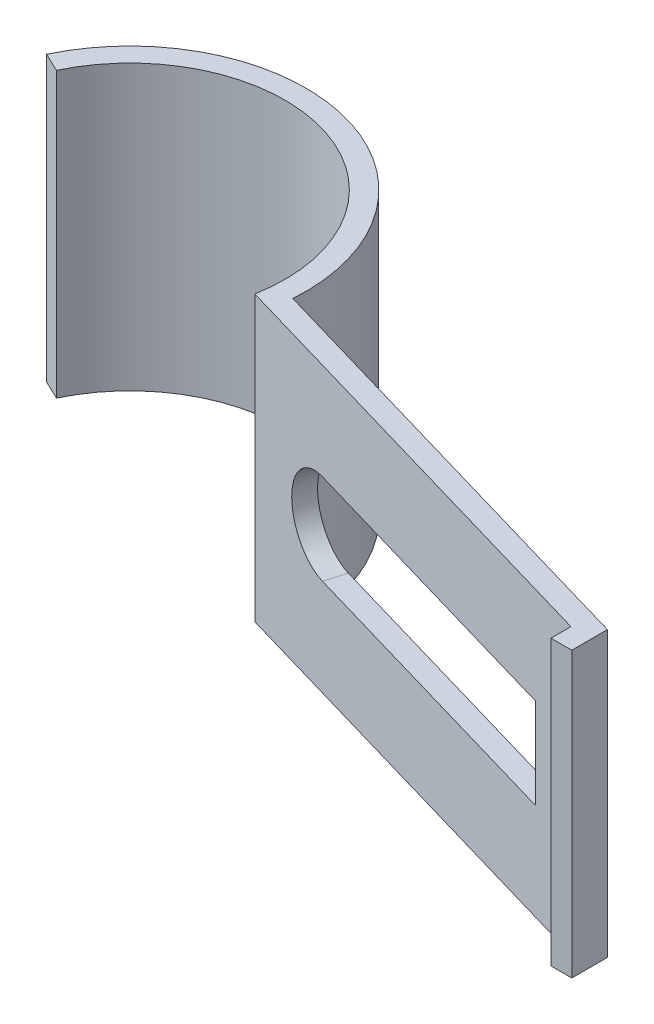
ISO-10303-21;
HEADER;
FILE_DESCRIPTION(('STEP AP214'),'2;1');
FILE_NAME('part.step','',(''),(''),'','','');
FILE_SCHEMA(('AUTOMOTIVE_DESIGN { 1 0 10303 214 1 1 1 1 }'));
ENDSEC;
DATA;
#1=APPLICATION_CONTEXT('core data for automotive mechanical design processes');
#2=APPLICATION_PROTOCOL_DEFINITION('international standard','automotive_design',2000,#1);
#3=PRODUCT_CONTEXT('',#1,'mechanical');
#4=PRODUCT('Part','Part','',(#3));
#5=PRODUCT_RELATED_PRODUCT_CATEGORY('part','',(#4));
#6=PRODUCT_DEFINITION_FORMATION('','',#4);
#7=PRODUCT_DEFINITION_CONTEXT('part definition',#1,'design');
#8=PRODUCT_DEFINITION('design','',#6,#7);
#9=PRODUCT_DEFINITION_SHAPE('','',#8);
#10=(LENGTH_UNIT() NAMED_UNIT(*) SI_UNIT(.MILLI.,.METRE.));
#11=(NAMED_UNIT(*) PLANE_ANGLE_UNIT() SI_UNIT($,.RADIAN.));
#12=(NAMED_UNIT(*) SI_UNIT($,.STERADIAN.) SOLID_ANGLE_UNIT());
#13=UNCERTAINTY_MEASURE_WITH_UNIT(LENGTH_MEASURE(1.E-05),#10,'distance_accuracy_value','');
#14=(GEOMETRIC_REPRESENTATION_CONTEXT(3) GLOBAL_UNCERTAINTY_ASSIGNED_CONTEXT((#13)) GLOBAL_UNIT_ASSIGNED_CONTEXT((#10,
#11,#12)) REPRESENTATION_CONTEXT('',''));
#15=CARTESIAN_POINT('',(0.,0.,0.));
#16=DIRECTION('',(0.,0.,1.));
#17=DIRECTION('',(1.,0.,0.));
#18=AXIS2_PLACEMENT_3D('',#15,#16,#17);
#19=CARTESIAN_POINT('',(0.15,4.08,0.));
#20=DIRECTION('',(0.,0.,-1.));
#21=DIRECTION('',(-1.,0.,0.));
#22=AXIS2_PLACEMENT_3D('',#19,#20,#21);
#23=PLANE('',#22);
#24=DIRECTION('',(1.,0.,0.));
#25=VECTOR('',#24,1.);
#26=CARTESIAN_POINT('',(0.15,0.,0.));
#27=LINE('',#26,#25);
#28=CARTESIAN_POINT('',(-0.15,0.,0.));
#29=VERTEX_POINT('',#28);
#30=CARTESIAN_POINT('',(0.15,0.,0.));
#31=VERTEX_POINT('',#30);
#32=EDGE_CURVE('E172',#29,#31,#27,.T.);
#33=ORIENTED_EDGE('',*,*,#32,.T.);
#34=DIRECTION('',(0.,-1.,0.));
#35=VECTOR('',#34,1.);
#36=CARTESIAN_POINT('',(0.15,4.08,0.));
#37=LINE('',#36,#35);
#38=CARTESIAN_POINT('',(0.15,4.08,0.));
#39=VERTEX_POINT('',#38);
#40=EDGE_CURVE('E11',#39,#31,#37,.T.);
#41=ORIENTED_EDGE('',*,*,#40,.F.);
#42=DIRECTION('',(1.,0.,0.));
#43=VECTOR('',#42,1.);
#44=CARTESIAN_POINT('',(0.15,4.08,0.));
#45=LINE('',#44,#43);
#46=CARTESIAN_POINT('',(-0.15,4.08,0.));
#47=VERTEX_POINT('',#46);
#48=EDGE_CURVE('E174',#47,#39,#45,.T.);
#49=ORIENTED_EDGE('',*,*,#48,.F.);
#50=DIRECTION('',(0.,-1.,0.));
#51=VECTOR('',#50,1.);
#52=CARTESIAN_POINT('',(-0.15,4.08,0.));
#53=LINE('',#52,#51);
#54=EDGE_CURVE('E200',#47,#29,#53,.T.);
#55=ORIENTED_EDGE('',*,*,#54,.T.);
#56=EDGE_LOOP('',(#33,#41,#49,#55));
#57=FACE_BOUND('',#56,.T.);
#58=ADVANCED_FACE('F45',(#57),#23,.F.);
#59=CARTESIAN_POINT('',(0.15,4.08,0.));
#60=DIRECTION('',(-1.,0.,0.));
#61=DIRECTION('',(0.,0.,1.));
#62=AXIS2_PLACEMENT_3D('',#59,#60,#61);
#63=PLANE('',#62);
#64=DIRECTION('',(0.,0.,-1.));
#65=VECTOR('',#64,1.);
#66=CARTESIAN_POINT('',(0.15,0.,0.));
#67=LINE('',#66,#65);
#68=CARTESIAN_POINT('',(0.15,0.,-0.512520873162829));
#69=VERTEX_POINT('',#68);
#70=EDGE_CURVE('E204',#31,#69,#67,.T.);
#71=ORIENTED_EDGE('',*,*,#70,.T.);
#72=DIRECTION('',(0.,-1.,0.));
#73=VECTOR('',#72,1.);
#74=CARTESIAN_POINT('',(0.15,4.08,-0.512520873162829));
#75=LINE('',#74,#73);
#76=CARTESIAN_POINT('',(0.15,4.08,-0.512520873162829));
#77=VERTEX_POINT('',#76);
#78=EDGE_CURVE('E53',#77,#69,#75,.T.);
#79=ORIENTED_EDGE('',*,*,#78,.F.);
#80=DIRECTION('',(0.,0.,-1.));
#81=VECTOR('',#80,1.);
#82=CARTESIAN_POINT('',(0.15,4.08,0.));
#83=LINE('',#82,#81);
#84=EDGE_CURVE('E178',#39,#77,#83,.T.);
#85=ORIENTED_EDGE('',*,*,#84,.F.);
#86=ORIENTED_EDGE('',*,*,#40,.T.);
#87=EDGE_LOOP('',(#71,#79,#85,#86));
#88=FACE_BOUND('',#87,.T.);
#89=ADVANCED_FACE('F273',(#88),#63,.F.);
#90=CARTESIAN_POINT('',(0.15,4.08,-0.512520873162829));
#91=DIRECTION('',(-0.279829014030986,0.,0.960049854385931));
#92=DIRECTION('',(0.960049854385931,0.,0.279829014030986));
#93=AXIS2_PLACEMENT_3D('',#90,#91,#92);
#94=PLANE('',#93);
#95=DIRECTION('',(0.,-1.,0.));
#96=VECTOR('',#95,1.);
#97=CARTESIAN_POINT('',(-0.785140283657693,1.39,-0.785089409433234));
#98=LINE('',#97,#96);
#99=CARTESIAN_POINT('',(-0.785140283657693,2.69,-0.785089409433234));
#100=VERTEX_POINT('',#99);
#101=CARTESIAN_POINT('',(-0.785140283657693,1.39,-0.785089409433234));
#102=VERTEX_POINT('',#101);
#103=EDGE_CURVE('E147',#100,#102,#98,.T.);
#104=ORIENTED_EDGE('',*,*,#103,.F.);
#105=DIRECTION('',(0.960049854385931,0.,0.279829014030985));
#106=VECTOR('',#105,1.);
#107=CARTESIAN_POINT('',(-0.785140283657693,2.69,-0.785089409433234));
#108=LINE('',#107,#106);
#109=CARTESIAN_POINT('',(-5.10536462839438,2.69,-2.04431997257267));
#110=VERTEX_POINT('',#109);
#111=EDGE_CURVE('E60',#110,#100,#108,.T.);
#112=ORIENTED_EDGE('',*,*,#111,.F.);
#113=CARTESIAN_POINT('',(-5.10536462839438,2.04,-2.04431997257267));
#114=DIRECTION('',(0.279829014030986,0.,-0.960049854385931));
#115=DIRECTION('',(0.960049854385931,0.,0.279829014030986));
#116=AXIS2_PLACEMENT_3D('',#113,#114,#115);
#117=CIRCLE('',#116,0.65);
#118=CARTESIAN_POINT('',(-5.10536462839438,1.39,-2.04431997257267));
#119=VERTEX_POINT('',#118);
#120=EDGE_CURVE('E155',#119,#110,#117,.T.);
#121=ORIENTED_EDGE('',*,*,#120,.F.);
#122=DIRECTION('',(-0.960049854385931,0.,-0.279829014030985));
#123=VECTOR('',#122,1.);
#124=CARTESIAN_POINT('',(-0.785140283657693,1.39,-0.785089409433234));
#125=LINE('',#124,#123);
#126=EDGE_CURVE('E137',#102,#119,#125,.T.);
#127=ORIENTED_EDGE('',*,*,#126,.F.);
#128=EDGE_LOOP('',(#104,#112,#121,#127));
#129=FACE_BOUND('',#128,.T.);
#130=DIRECTION('',(-0.96004985438593,0.,-0.279829014030986));
#131=VECTOR('',#130,1.);
#132=CARTESIAN_POINT('',(0.15,0.,-0.512520873162829));
#133=LINE('',#132,#131);
#134=CARTESIAN_POINT('',(-6.2325576157067,0.,-2.37286676711804));
#135=VERTEX_POINT('',#134);
#136=EDGE_CURVE('E207',#69,#135,#133,.T.);
#137=ORIENTED_EDGE('',*,*,#136,.T.);
#138=DIRECTION('',(0.,-1.,0.));
#139=VECTOR('',#138,1.);
#140=CARTESIAN_POINT('',(-6.2325576157067,4.08,-2.37286676711804));
#141=LINE('',#140,#139);
#142=CARTESIAN_POINT('',(-6.2325576157067,4.08,-2.37286676711804));
#143=VERTEX_POINT('',#142);
#144=EDGE_CURVE('E243',#143,#135,#141,.T.);
#145=ORIENTED_EDGE('',*,*,#144,.F.);
#146=DIRECTION('',(-0.96004985438593,0.,-0.279829014030986));
#147=VECTOR('',#146,1.);
#148=CARTESIAN_POINT('',(0.15,4.08,-0.512520873162829));
#149=LINE('',#148,#147);
#150=EDGE_CURVE('E182',#77,#143,#149,.T.);
#151=ORIENTED_EDGE('',*,*,#150,.F.);
#152=ORIENTED_EDGE('',*,*,#78,.T.);
#153=EDGE_LOOP('',(#137,#145,#151,#152));
#154=FACE_BOUND('',#153,.T.);
#155=ADVANCED_FACE('F152',(#129,#154),#94,.F.);
#156=CARTESIAN_POINT('',(-8.75655910648278,4.08,-2.55584044059354));
#157=DIRECTION('',(0.,-1.,0.));
#158=DIRECTION('',(0.,0.,-1.));
#159=AXIS2_PLACEMENT_3D('',#156,#157,#158);
#160=CYLINDRICAL_SURFACE('',#159,2.530625);
#161=CARTESIAN_POINT('',(-8.75655910648278,0.,-2.55584044059354));
#162=DIRECTION('',(0.,1.,0.));
#163=DIRECTION('',(0.,0.,1.));
#164=AXIS2_PLACEMENT_3D('',#161,#162,#163);
#165=CIRCLE('',#164,2.530625);
#166=CARTESIAN_POINT('',(-11.0416102254361,0.,-3.64331654350111));
#167=VERTEX_POINT('',#166);
#168=EDGE_CURVE('E210',#135,#167,#165,.T.);
#169=ORIENTED_EDGE('',*,*,#168,.T.);
#170=DIRECTION('',(0.,-1.,0.));
#171=VECTOR('',#170,1.);
#172=CARTESIAN_POINT('',(-11.0416102254361,4.08,-3.64331654350111));
#173=LINE('',#172,#171);
#174=CARTESIAN_POINT('',(-11.0416102254361,4.08,-3.64331654350111));
#175=VERTEX_POINT('',#174);
#176=EDGE_CURVE('E239',#175,#167,#173,.T.);
#177=ORIENTED_EDGE('',*,*,#176,.F.);
#178=CARTESIAN_POINT('',(-8.75655910648278,4.08,-2.55584044059354));
#179=DIRECTION('',(0.,1.,0.));
#180=DIRECTION('',(0.,0.,1.));
#181=AXIS2_PLACEMENT_3D('',#178,#179,#180);
#182=CIRCLE('',#181,2.530625);
#183=EDGE_CURVE('E185',#143,#175,#182,.T.);
#184=ORIENTED_EDGE('',*,*,#183,.F.);
#185=ORIENTED_EDGE('',*,*,#144,.T.);
#186=EDGE_LOOP('',(#169,#177,#184,#185));
#187=FACE_BOUND('',#186,.T.);
#188=ADVANCED_FACE('F261',(#187),#160,.T.);
#189=CARTESIAN_POINT('',(-11.0416102254361,4.08,-3.64331654350111));
#190=DIRECTION('',(0.429726294060784,0.,-0.902959197413031));
#191=DIRECTION('',(-0.902959197413031,0.,-0.429726294060784));
#192=AXIS2_PLACEMENT_3D('',#189,#190,#191);
#193=PLANE('',#192);
#194=DIRECTION('',(0.902959197413031,0.,0.429726294060784));
#195=VECTOR('',#194,1.);
#196=CARTESIAN_POINT('',(-11.0416102254361,0.,-3.64331654350111));
#197=LINE('',#196,#195);
#198=CARTESIAN_POINT('',(-10.7707224662122,0.,-3.51439865528288));
#199=VERTEX_POINT('',#198);
#200=EDGE_CURVE('E213',#167,#199,#197,.T.);
#201=ORIENTED_EDGE('',*,*,#200,.T.);
#202=DIRECTION('',(0.,-1.,0.));
#203=VECTOR('',#202,1.);
#204=CARTESIAN_POINT('',(-10.7707224662122,4.08,-3.51439865528288));
#205=LINE('',#204,#203);
#206=CARTESIAN_POINT('',(-10.7707224662122,4.08,-3.51439865528288));
#207=VERTEX_POINT('',#206);
#208=EDGE_CURVE('E235',#207,#199,#205,.T.);
#209=ORIENTED_EDGE('',*,*,#208,.F.);
#210=DIRECTION('',(0.902959197413031,0.,0.429726294060784));
#211=VECTOR('',#210,1.);
#212=CARTESIAN_POINT('',(-11.0416102254361,4.08,-3.64331654350111));
#213=LINE('',#212,#211);
#214=EDGE_CURVE('E188',#175,#207,#213,.T.);
#215=ORIENTED_EDGE('',*,*,#214,.F.);
#216=ORIENTED_EDGE('',*,*,#176,.T.);
#217=EDGE_LOOP('',(#201,#209,#215,#216));
#218=FACE_BOUND('',#217,.T.);
#219=ADVANCED_FACE('F265',(#218),#193,.F.);
#220=CARTESIAN_POINT('',(-8.75655910648278,4.08,-2.55584044059354));
#221=DIRECTION('',(0.,-1.,0.));
#222=DIRECTION('',(0.,0.,-1.));
#223=AXIS2_PLACEMENT_3D('',#220,#221,#222);
#224=CYLINDRICAL_SURFACE('',#223,2.230625);
#225=CARTESIAN_POINT('',(-8.75655910648278,0.,-2.55584044059354));
#226=DIRECTION('',(0.,-1.,0.));
#227=DIRECTION('',(0.,0.,1.));
#228=AXIS2_PLACEMENT_3D('',#225,#226,#227);
#229=CIRCLE('',#228,2.230625);
#230=CARTESIAN_POINT('',(-6.56198898734886,0.,-2.15640348332803));
#231=VERTEX_POINT('',#230);
#232=EDGE_CURVE('E216',#199,#231,#229,.T.);
#233=ORIENTED_EDGE('',*,*,#232,.T.);
#234=DIRECTION('',(0.,-1.,0.));
#235=VECTOR('',#234,1.);
#236=CARTESIAN_POINT('',(-6.56198898734886,4.08,-2.15640348332803));
#237=LINE('',#236,#235);
#238=CARTESIAN_POINT('',(-6.56198898734886,4.08,-2.15640348332803));
#239=VERTEX_POINT('',#238);
#240=EDGE_CURVE('E231',#239,#231,#237,.T.);
#241=ORIENTED_EDGE('',*,*,#240,.F.);
#242=CARTESIAN_POINT('',(-8.75655910648278,4.08,-2.55584044059354));
#243=DIRECTION('',(0.,-1.,0.));
#244=DIRECTION('',(0.,0.,1.));
#245=AXIS2_PLACEMENT_3D('',#242,#243,#244);
#246=CIRCLE('',#245,2.230625);
#247=EDGE_CURVE('E191',#207,#239,#246,.T.);
#248=ORIENTED_EDGE('',*,*,#247,.F.);
#249=ORIENTED_EDGE('',*,*,#208,.T.);
#250=EDGE_LOOP('',(#233,#241,#248,#249));
#251=FACE_BOUND('',#250,.T.);
#252=ADVANCED_FACE('F286',(#251),#224,.F.);
#253=CARTESIAN_POINT('',(-0.15,4.08,-0.287479126837171));
#254=DIRECTION('',(0.279829014030986,0.,-0.960049854385931));
#255=DIRECTION('',(-0.960049854385931,0.,-0.279829014030986));
#256=AXIS2_PLACEMENT_3D('',#253,#254,#255);
#257=PLANE('',#256);
#258=CARTESIAN_POINT('',(-5.18931333260368,2.04,-1.75630501625689));
#259=DIRECTION('',(0.279829014030986,0.,-0.960049854385931));
#260=DIRECTION('',(-0.960049854385931,0.,-0.279829014030986));
#261=AXIS2_PLACEMENT_3D('',#258,#259,#260);
#262=CIRCLE('',#261,0.65);
#263=CARTESIAN_POINT('',(-5.18931333260368,2.69,-1.75630501625689));
#264=VERTEX_POINT('',#263);
#265=CARTESIAN_POINT('',(-5.18931333260368,1.39,-1.75630501625689));
#266=VERTEX_POINT('',#265);
#267=EDGE_CURVE('E389',#264,#266,#262,.F.);
#268=ORIENTED_EDGE('',*,*,#267,.F.);
#269=DIRECTION('',(-0.960049854385931,0.,-0.279829014030986));
#270=VECTOR('',#269,1.);
#271=CARTESIAN_POINT('',(-0.869088987866988,2.69,-0.497074453117455));
#272=LINE('',#271,#270);
#273=CARTESIAN_POINT('',(-0.869088987866988,2.69,-0.497074453117455));
#274=VERTEX_POINT('',#273);
#275=EDGE_CURVE('E173',#274,#264,#272,.T.);
#276=ORIENTED_EDGE('',*,*,#275,.F.);
#277=DIRECTION('',(0.,1.,0.));
#278=VECTOR('',#277,1.);
#279=CARTESIAN_POINT('',(-0.869088987866988,1.39,-0.497074453117455));
#280=LINE('',#279,#278);
#281=CARTESIAN_POINT('',(-0.869088987866988,1.39,-0.497074453117455));
#282=VERTEX_POINT('',#281);
#283=EDGE_CURVE('E169',#282,#274,#280,.T.);
#284=ORIENTED_EDGE('',*,*,#283,.F.);
#285=DIRECTION('',(0.960049854385931,0.,0.279829014030986));
#286=VECTOR('',#285,1.);
#287=CARTESIAN_POINT('',(-0.869088987866988,1.39,-0.497074453117455));
#288=LINE('',#287,#286);
#289=EDGE_CURVE('E140',#266,#282,#288,.T.);
#290=ORIENTED_EDGE('',*,*,#289,.F.);
#291=EDGE_LOOP('',(#268,#276,#284,#290));
#292=FACE_BOUND('',#291,.T.);
#293=DIRECTION('',(0.960049854385931,0.,0.279829014030986));
#294=VECTOR('',#293,1.);
#295=CARTESIAN_POINT('',(-0.15,0.,-0.287479126837171));
#296=LINE('',#295,#294);
#297=CARTESIAN_POINT('',(-0.15,0.,-0.287479126837171));
#298=VERTEX_POINT('',#297);
#299=EDGE_CURVE('E219',#231,#298,#296,.T.);
#300=ORIENTED_EDGE('',*,*,#299,.T.);
#301=DIRECTION('',(0.,-1.,0.));
#302=VECTOR('',#301,1.);
#303=CARTESIAN_POINT('',(-0.15,4.08,-0.287479126837171));
#304=LINE('',#303,#302);
#305=CARTESIAN_POINT('',(-0.15,4.08,-0.287479126837171));
#306=VERTEX_POINT('',#305);
#307=EDGE_CURVE('E227',#306,#298,#304,.T.);
#308=ORIENTED_EDGE('',*,*,#307,.F.);
#309=DIRECTION('',(0.960049854385931,0.,0.279829014030986));
#310=VECTOR('',#309,1.);
#311=CARTESIAN_POINT('',(-0.15,4.08,-0.287479126837171));
#312=LINE('',#311,#310);
#313=EDGE_CURVE('E194',#239,#306,#312,.T.);
#314=ORIENTED_EDGE('',*,*,#313,.F.);
#315=ORIENTED_EDGE('',*,*,#240,.T.);
#316=EDGE_LOOP('',(#300,#308,#314,#315));
#317=FACE_BOUND('',#316,.T.);
#318=ADVANCED_FACE('F284',(#292,#317),#257,.F.);
#319=CARTESIAN_POINT('',(-0.15,4.08,0.));
#320=DIRECTION('',(1.,0.,0.));
#321=DIRECTION('',(0.,0.,-1.));
#322=AXIS2_PLACEMENT_3D('',#319,#320,#321);
#323=PLANE('',#322);
#324=DIRECTION('',(0.,0.,1.));
#325=VECTOR('',#324,1.);
#326=CARTESIAN_POINT('',(-0.15,0.,0.));
#327=LINE('',#326,#325);
#328=EDGE_CURVE('E179',#298,#29,#327,.T.);
#329=ORIENTED_EDGE('',*,*,#328,.T.);
#330=ORIENTED_EDGE('',*,*,#54,.F.);
#331=DIRECTION('',(0.,0.,1.));
#332=VECTOR('',#331,1.);
#333=CARTESIAN_POINT('',(-0.15,4.08,0.));
#334=LINE('',#333,#332);
#335=EDGE_CURVE('E197',#306,#47,#334,.T.);
#336=ORIENTED_EDGE('',*,*,#335,.F.);
#337=ORIENTED_EDGE('',*,*,#307,.T.);
#338=EDGE_LOOP('',(#329,#330,#336,#337));
#339=FACE_BOUND('',#338,.T.);
#340=ADVANCED_FACE('F279',(#339),#323,.F.);
#341=CARTESIAN_POINT('',(-8.75655910648278,4.08,-2.55584044059354));
#342=DIRECTION('',(0.,1.,0.));
#343=DIRECTION('',(0.,0.,1.));
#344=AXIS2_PLACEMENT_3D('',#341,#342,#343);
#345=PLANE('',#344);
#346=ORIENTED_EDGE('',*,*,#48,.T.);
#347=ORIENTED_EDGE('',*,*,#84,.T.);
#348=ORIENTED_EDGE('',*,*,#150,.T.);
#349=ORIENTED_EDGE('',*,*,#183,.T.);
#350=ORIENTED_EDGE('',*,*,#214,.T.);
#351=ORIENTED_EDGE('',*,*,#247,.T.);
#352=ORIENTED_EDGE('',*,*,#313,.T.);
#353=ORIENTED_EDGE('',*,*,#335,.T.);
#354=EDGE_LOOP('',(#346,#347,#348,#349,#350,#351,#352,#353));
#355=FACE_BOUND('',#354,.T.);
#356=ADVANCED_FACE('F269',(#355),#345,.T.);
#357=CARTESIAN_POINT('',(-8.75655910648278,0.,-2.55584044059354));
#358=DIRECTION('',(0.,1.,0.));
#359=DIRECTION('',(0.,0.,1.));
#360=AXIS2_PLACEMENT_3D('',#357,#358,#359);
#361=PLANE('',#360);
#362=ORIENTED_EDGE('',*,*,#32,.F.);
#363=ORIENTED_EDGE('',*,*,#328,.F.);
#364=ORIENTED_EDGE('',*,*,#299,.F.);
#365=ORIENTED_EDGE('',*,*,#232,.F.);
#366=ORIENTED_EDGE('',*,*,#200,.F.);
#367=ORIENTED_EDGE('',*,*,#168,.F.);
#368=ORIENTED_EDGE('',*,*,#136,.F.);
#369=ORIENTED_EDGE('',*,*,#70,.F.);
#370=EDGE_LOOP('',(#362,#363,#364,#365,#366,#367,#368,#369));
#371=FACE_BOUND('',#370,.T.);
#372=ADVANCED_FACE('F256',(#371),#361,.F.);
#373=CARTESIAN_POINT('',(-2.35541311722164,2.69,4.60227262101842));
#374=DIRECTION('',(0.,1.,0.));
#375=DIRECTION('',(0.,0.,1.));
#376=AXIS2_PLACEMENT_3D('',#373,#374,#375);
#377=PLANE('',#376);
#378=ORIENTED_EDGE('',*,*,#275,.T.);
#379=DIRECTION('',(0.279829014030986,0.,-0.960049854385931));
#380=VECTOR('',#379,1.);
#381=CARTESIAN_POINT('',(-6.67563746195833,2.69,3.34304205787899));
#382=LINE('',#381,#380);
#383=EDGE_CURVE('E162',#264,#110,#382,.T.);
#384=ORIENTED_EDGE('',*,*,#383,.T.);
#385=ORIENTED_EDGE('',*,*,#111,.T.);
#386=DIRECTION('',(0.279829014030986,0.,-0.960049854385931));
#387=VECTOR('',#386,1.);
#388=CARTESIAN_POINT('',(-2.35541311722164,2.69,4.60227262101842));
#389=LINE('',#388,#387);
#390=EDGE_CURVE('E144',#274,#100,#389,.T.);
#391=ORIENTED_EDGE('',*,*,#390,.F.);
#392=EDGE_LOOP('',(#378,#384,#385,#391));
#393=FACE_BOUND('',#392,.T.);
#394=ADVANCED_FACE('F351',(#393),#377,.F.);
#395=CARTESIAN_POINT('',(-6.67563746195833,2.04,3.34304205787899));
#396=DIRECTION('',(0.279829014030986,0.,-0.960049854385931));
#397=DIRECTION('',(-0.960049854385931,0.,-0.279829014030986));
#398=AXIS2_PLACEMENT_3D('',#395,#396,#397);
#399=CYLINDRICAL_SURFACE('',#398,0.65);
#400=ORIENTED_EDGE('',*,*,#267,.T.);
#401=DIRECTION('',(0.279829014030986,0.,-0.960049854385931));
#402=VECTOR('',#401,1.);
#403=CARTESIAN_POINT('',(-6.67563746195833,1.39,3.34304205787899));
#404=LINE('',#403,#402);
#405=EDGE_CURVE('E143',#266,#119,#404,.T.);
#406=ORIENTED_EDGE('',*,*,#405,.T.);
#407=ORIENTED_EDGE('',*,*,#120,.T.);
#408=ORIENTED_EDGE('',*,*,#383,.F.);
#409=EDGE_LOOP('',(#400,#406,#407,#408));
#410=FACE_BOUND('',#409,.T.);
#411=ADVANCED_FACE('F359',(#410),#399,.F.);
#412=CARTESIAN_POINT('',(-2.35541311722164,1.39,4.60227262101842));
#413=DIRECTION('',(0.,-1.,0.));
#414=DIRECTION('',(0.,0.,-1.));
#415=AXIS2_PLACEMENT_3D('',#412,#413,#414);
#416=PLANE('',#415);
#417=ORIENTED_EDGE('',*,*,#289,.T.);
#418=DIRECTION('',(0.279829014030986,0.,-0.960049854385931));
#419=VECTOR('',#418,1.);
#420=CARTESIAN_POINT('',(-2.35541311722164,1.39,4.60227262101842));
#421=LINE('',#420,#419);
#422=EDGE_CURVE('E68',#282,#102,#421,.T.);
#423=ORIENTED_EDGE('',*,*,#422,.T.);
#424=ORIENTED_EDGE('',*,*,#126,.T.);
#425=ORIENTED_EDGE('',*,*,#405,.F.);
#426=EDGE_LOOP('',(#417,#423,#424,#425));
#427=FACE_BOUND('',#426,.T.);
#428=ADVANCED_FACE('F134',(#427),#416,.F.);
#429=CARTESIAN_POINT('',(-2.35541311722164,1.39,4.60227262101842));
#430=DIRECTION('',(0.960049854385931,0.,0.279829014030986));
#431=DIRECTION('',(0.279829014030986,0.,-0.960049854385931));
#432=AXIS2_PLACEMENT_3D('',#429,#430,#431);
#433=PLANE('',#432);
#434=ORIENTED_EDGE('',*,*,#283,.T.);
#435=ORIENTED_EDGE('',*,*,#390,.T.);
#436=ORIENTED_EDGE('',*,*,#103,.T.);
#437=ORIENTED_EDGE('',*,*,#422,.F.);
#438=EDGE_LOOP('',(#434,#435,#436,#437));
#439=FACE_BOUND('',#438,.T.);
#440=ADVANCED_FACE('F148',(#439),#433,.F.);
#441=CLOSED_SHELL('',(#58,#89,#155,#188,#219,#252,#318,#340,#356,#372,#394,#411,#428,#440));
#442=MANIFOLD_SOLID_BREP('B2',#441);
#443=ADVANCED_BREP_SHAPE_REPRESENTATION('',(#18,#442),#14);
#444=SHAPE_DEFINITION_REPRESENTATION(#9,#443);
ENDSEC;
END-ISO-10303-21;
